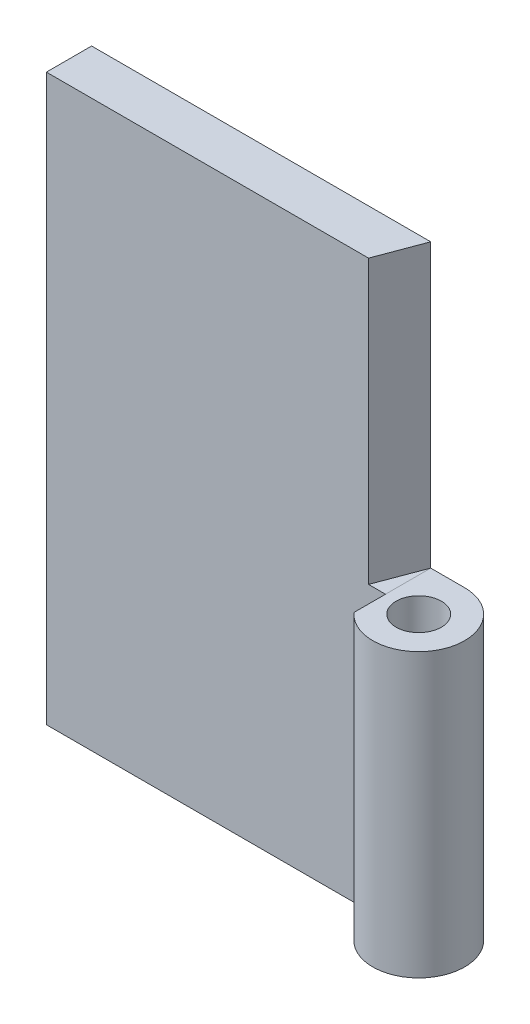
ISO-10303-21;
HEADER;
FILE_DESCRIPTION(('STEP AP214'),'2;1');
FILE_NAME('part.step','',(''),(''),'','','');
FILE_SCHEMA(('AUTOMOTIVE_DESIGN { 1 0 10303 214 1 1 1 1 }'));
ENDSEC;
DATA;
#1=APPLICATION_CONTEXT('core data for automotive mechanical design processes');
#2=APPLICATION_PROTOCOL_DEFINITION('international standard','automotive_design',2000,#1);
#3=PRODUCT_CONTEXT('',#1,'mechanical');
#4=PRODUCT('Part','Part','',(#3));
#5=PRODUCT_RELATED_PRODUCT_CATEGORY('part','',(#4));
#6=PRODUCT_DEFINITION_FORMATION('','',#4);
#7=PRODUCT_DEFINITION_CONTEXT('part definition',#1,'design');
#8=PRODUCT_DEFINITION('design','',#6,#7);
#9=PRODUCT_DEFINITION_SHAPE('','',#8);
#10=(LENGTH_UNIT() NAMED_UNIT(*) SI_UNIT(.MILLI.,.METRE.));
#11=(NAMED_UNIT(*) PLANE_ANGLE_UNIT() SI_UNIT($,.RADIAN.));
#12=(NAMED_UNIT(*) SI_UNIT($,.STERADIAN.) SOLID_ANGLE_UNIT());
#13=UNCERTAINTY_MEASURE_WITH_UNIT(LENGTH_MEASURE(1.E-05),#10,'distance_accuracy_value','');
#14=(GEOMETRIC_REPRESENTATION_CONTEXT(3) GLOBAL_UNCERTAINTY_ASSIGNED_CONTEXT((#13)) GLOBAL_UNIT_ASSIGNED_CONTEXT((#10,
#11,#12)) REPRESENTATION_CONTEXT('',''));
#15=CARTESIAN_POINT('',(0.,0.,0.));
#16=DIRECTION('',(0.,0.,1.));
#17=DIRECTION('',(1.,0.,0.));
#18=AXIS2_PLACEMENT_3D('',#15,#16,#17);
#19=CARTESIAN_POINT('',(15.,-12.5,3.4));
#20=DIRECTION('',(-1.,0.,0.));
#21=DIRECTION('',(0.,0.,1.));
#22=AXIS2_PLACEMENT_3D('',#19,#20,#21);
#23=PLANE('',#22);
#24=DIRECTION('',(0.,0.,-1.));
#25=VECTOR('',#24,1.);
#26=CARTESIAN_POINT('',(15.,-25.,3.4));
#27=LINE('',#26,#25);
#28=CARTESIAN_POINT('',(15.,-25.,3.4));
#29=VERTEX_POINT('',#28);
#30=CARTESIAN_POINT('',(15.,-25.,0.));
#31=VERTEX_POINT('',#30);
#32=EDGE_CURVE('E99',#29,#31,#27,.T.);
#33=ORIENTED_EDGE('',*,*,#32,.F.);
#34=DIRECTION('',(0.,-1.,0.));
#35=VECTOR('',#34,1.);
#36=CARTESIAN_POINT('',(15.,-12.5,3.4));
#37=LINE('',#36,#35);
#38=CARTESIAN_POINT('',(15.,-12.5,3.4));
#39=VERTEX_POINT('',#38);
#40=EDGE_CURVE('E12',#39,#29,#37,.T.);
#41=ORIENTED_EDGE('',*,*,#40,.F.);
#42=DIRECTION('',(0.,0.,-1.));
#43=VECTOR('',#42,1.);
#44=CARTESIAN_POINT('',(15.,-12.5,3.4));
#45=LINE('',#44,#43);
#46=CARTESIAN_POINT('',(15.,-12.5,0.));
#47=VERTEX_POINT('',#46);
#48=EDGE_CURVE('E88',#39,#47,#45,.T.);
#49=ORIENTED_EDGE('',*,*,#48,.T.);
#50=DIRECTION('',(0.,-1.,0.));
#51=VECTOR('',#50,1.);
#52=CARTESIAN_POINT('',(15.,-12.5,0.));
#53=LINE('',#52,#51);
#54=EDGE_CURVE('E47',#47,#31,#53,.T.);
#55=ORIENTED_EDGE('',*,*,#54,.T.);
#56=EDGE_LOOP('',(#33,#41,#49,#55));
#57=FACE_BOUND('',#56,.T.);
#58=ADVANCED_FACE('F44',(#57),#23,.T.);
#59=CARTESIAN_POINT('',(16.5,-12.5,2.03088235294118));
#60=DIRECTION('',(0.,-1.,0.));
#61=DIRECTION('',(0.,0.,-1.));
#62=AXIS2_PLACEMENT_3D('',#59,#60,#61);
#63=CYLINDRICAL_SURFACE('',#62,2.03088235294118);
#64=CARTESIAN_POINT('',(16.5,-25.,2.03088235294118));
#65=DIRECTION('',(0.,-1.,0.));
#66=DIRECTION('',(0.,0.,-1.));
#67=AXIS2_PLACEMENT_3D('',#64,#65,#66);
#68=CIRCLE('',#67,2.03088235294118);
#69=CARTESIAN_POINT('',(16.5,-25.,0.));
#70=VERTEX_POINT('',#69);
#71=EDGE_CURVE('E90',#70,#29,#68,.T.);
#72=ORIENTED_EDGE('',*,*,#71,.F.);
#73=DIRECTION('',(0.,-1.,0.));
#74=VECTOR('',#73,1.);
#75=CARTESIAN_POINT('',(16.5,-12.5,0.));
#76=LINE('',#75,#74);
#77=CARTESIAN_POINT('',(16.5,-12.5,0.));
#78=VERTEX_POINT('',#77);
#79=EDGE_CURVE('E53',#78,#70,#76,.T.);
#80=ORIENTED_EDGE('',*,*,#79,.F.);
#81=CARTESIAN_POINT('',(16.5,-12.5,2.03088235294118));
#82=DIRECTION('',(0.,-1.,0.));
#83=DIRECTION('',(0.,0.,-1.));
#84=AXIS2_PLACEMENT_3D('',#81,#82,#83);
#85=CIRCLE('',#84,2.03088235294118);
#86=EDGE_CURVE('E85',#78,#39,#85,.T.);
#87=ORIENTED_EDGE('',*,*,#86,.T.);
#88=ORIENTED_EDGE('',*,*,#40,.T.);
#89=EDGE_LOOP('',(#72,#80,#87,#88));
#90=FACE_BOUND('',#89,.T.);
#91=ADVANCED_FACE('F103',(#90),#63,.T.);
#92=CARTESIAN_POINT('',(15.,-12.5,0.));
#93=DIRECTION('',(0.,0.,-1.));
#94=DIRECTION('',(-1.,0.,0.));
#95=AXIS2_PLACEMENT_3D('',#92,#93,#94);
#96=PLANE('',#95);
#97=DIRECTION('',(1.,0.,0.));
#98=VECTOR('',#97,1.);
#99=CARTESIAN_POINT('',(15.,-25.,0.));
#100=LINE('',#99,#98);
#101=EDGE_CURVE('E83',#31,#70,#100,.T.);
#102=ORIENTED_EDGE('',*,*,#101,.F.);
#103=ORIENTED_EDGE('',*,*,#54,.F.);
#104=DIRECTION('',(1.,0.,0.));
#105=VECTOR('',#104,1.);
#106=CARTESIAN_POINT('',(15.,-12.5,0.));
#107=LINE('',#106,#105);
#108=EDGE_CURVE('E81',#47,#78,#107,.T.);
#109=ORIENTED_EDGE('',*,*,#108,.T.);
#110=ORIENTED_EDGE('',*,*,#79,.T.);
#111=EDGE_LOOP('',(#102,#103,#109,#110));
#112=FACE_BOUND('',#111,.T.);
#113=ADVANCED_FACE('F80',(#112),#96,.T.);
#114=CARTESIAN_POINT('',(16.5,-12.5,2.03088235294118));
#115=DIRECTION('',(0.,-1.,0.));
#116=DIRECTION('',(0.,0.,-1.));
#117=AXIS2_PLACEMENT_3D('',#114,#115,#116);
#118=PLANE('',#117);
#119=CARTESIAN_POINT('',(16.5,-12.5,2.03088235294118));
#120=DIRECTION('',(0.,-1.,0.));
#121=DIRECTION('',(0.,0.,-1.));
#122=AXIS2_PLACEMENT_3D('',#119,#120,#121);
#123=CIRCLE('',#122,1.);
#124=CARTESIAN_POINT('',(16.5,-12.5,1.03088235294118));
#125=VERTEX_POINT('',#124);
#126=EDGE_CURVE('E95',#125,#125,#123,.T.);
#127=ORIENTED_EDGE('',*,*,#126,.T.);
#128=EDGE_LOOP('',(#127));
#129=FACE_BOUND('',#128,.T.);
#130=ORIENTED_EDGE('',*,*,#48,.F.);
#131=ORIENTED_EDGE('',*,*,#86,.F.);
#132=ORIENTED_EDGE('',*,*,#108,.F.);
#133=EDGE_LOOP('',(#130,#131,#132));
#134=FACE_BOUND('',#133,.T.);
#135=ADVANCED_FACE('F87',(#129,#134),#118,.F.);
#136=CARTESIAN_POINT('',(16.5,-25.,2.03088235294118));
#137=DIRECTION('',(0.,-1.,0.));
#138=DIRECTION('',(0.,0.,-1.));
#139=AXIS2_PLACEMENT_3D('',#136,#137,#138);
#140=PLANE('',#139);
#141=CARTESIAN_POINT('',(16.5,-25.,2.03088235294118));
#142=DIRECTION('',(0.,-1.,0.));
#143=DIRECTION('',(0.,0.,-1.));
#144=AXIS2_PLACEMENT_3D('',#141,#142,#143);
#145=CIRCLE('',#144,1.);
#146=CARTESIAN_POINT('',(16.5,-25.,1.03088235294118));
#147=VERTEX_POINT('',#146);
#148=EDGE_CURVE('E125',#147,#147,#145,.T.);
#149=ORIENTED_EDGE('',*,*,#148,.F.);
#150=EDGE_LOOP('',(#149));
#151=FACE_BOUND('',#150,.T.);
#152=ORIENTED_EDGE('',*,*,#32,.T.);
#153=ORIENTED_EDGE('',*,*,#101,.T.);
#154=ORIENTED_EDGE('',*,*,#71,.T.);
#155=EDGE_LOOP('',(#152,#153,#154));
#156=FACE_BOUND('',#155,.T.);
#157=ADVANCED_FACE('F102',(#151,#156),#140,.T.);
#158=CARTESIAN_POINT('',(16.5,0.,2.03088235294118));
#159=DIRECTION('',(0.,-1.,0.));
#160=DIRECTION('',(0.,0.,-1.));
#161=AXIS2_PLACEMENT_3D('',#158,#159,#160);
#162=CYLINDRICAL_SURFACE('',#161,1.);
#163=ORIENTED_EDGE('',*,*,#148,.T.);
#164=EDGE_LOOP('',(#163));
#165=FACE_BOUND('',#164,.T.);
#166=ORIENTED_EDGE('',*,*,#126,.F.);
#167=EDGE_LOOP('',(#166));
#168=FACE_BOUND('',#167,.T.);
#169=ADVANCED_FACE('F113',(#165,#168),#162,.F.);
#170=CLOSED_SHELL('',(#58,#91,#113,#135,#157,#169));
#171=MANIFOLD_SOLID_BREP('B2',#170);
#172=CARTESIAN_POINT('',(0.,0.,2.));
#173=DIRECTION('',(1.,0.,0.));
#174=DIRECTION('',(0.,1.,0.));
#175=AXIS2_PLACEMENT_3D('',#172,#173,#174);
#176=PLANE('',#175);
#177=DIRECTION('',(0.,-1.,0.));
#178=VECTOR('',#177,1.);
#179=CARTESIAN_POINT('',(0.,0.,0.));
#180=LINE('',#179,#178);
#181=CARTESIAN_POINT('',(0.,0.,0.));
#182=VERTEX_POINT('',#181);
#183=CARTESIAN_POINT('',(0.,-25.,0.));
#184=VERTEX_POINT('',#183);
#185=EDGE_CURVE('E241',#182,#184,#180,.T.);
#186=ORIENTED_EDGE('',*,*,#185,.T.);
#187=DIRECTION('',(0.,0.,-1.));
#188=VECTOR('',#187,1.);
#189=CARTESIAN_POINT('',(0.,-25.,2.));
#190=LINE('',#189,#188);
#191=CARTESIAN_POINT('',(0.,-25.,2.));
#192=VERTEX_POINT('',#191);
#193=EDGE_CURVE('E42',#192,#184,#190,.T.);
#194=ORIENTED_EDGE('',*,*,#193,.F.);
#195=DIRECTION('',(0.,-1.,0.));
#196=VECTOR('',#195,1.);
#197=CARTESIAN_POINT('',(0.,0.,2.));
#198=LINE('',#197,#196);
#199=CARTESIAN_POINT('',(0.,0.,2.));
#200=VERTEX_POINT('',#199);
#201=EDGE_CURVE('E249',#200,#192,#198,.T.);
#202=ORIENTED_EDGE('',*,*,#201,.F.);
#203=DIRECTION('',(0.,0.,-1.));
#204=VECTOR('',#203,1.);
#205=CARTESIAN_POINT('',(0.,0.,2.));
#206=LINE('',#205,#204);
#207=EDGE_CURVE('E233',#200,#182,#206,.T.);
#208=ORIENTED_EDGE('',*,*,#207,.T.);
#209=EDGE_LOOP('',(#186,#194,#202,#208));
#210=FACE_BOUND('',#209,.T.);
#211=ADVANCED_FACE('F162',(#210),#176,.F.);
#212=CARTESIAN_POINT('',(0.,-25.,2.));
#213=DIRECTION('',(0.,1.,0.));
#214=DIRECTION('',(0.,0.,1.));
#215=AXIS2_PLACEMENT_3D('',#212,#213,#214);
#216=PLANE('',#215);
#217=DIRECTION('',(1.,0.,0.));
#218=VECTOR('',#217,1.);
#219=CARTESIAN_POINT('',(0.,-25.,0.));
#220=LINE('',#219,#218);
#221=CARTESIAN_POINT('',(15.,-25.,0.));
#222=VERTEX_POINT('',#221);
#223=EDGE_CURVE('E244',#184,#222,#220,.T.);
#224=ORIENTED_EDGE('',*,*,#223,.T.);
#225=DIRECTION('',(0.,0.,-1.));
#226=VECTOR('',#225,1.);
#227=CARTESIAN_POINT('',(15.,-25.,2.));
#228=LINE('',#227,#226);
#229=CARTESIAN_POINT('',(15.,-25.,2.));
#230=VERTEX_POINT('',#229);
#231=EDGE_CURVE('E169',#230,#222,#228,.T.);
#232=ORIENTED_EDGE('',*,*,#231,.F.);
#233=DIRECTION('',(1.,0.,0.));
#234=VECTOR('',#233,1.);
#235=CARTESIAN_POINT('',(0.,-25.,2.));
#236=LINE('',#235,#234);
#237=EDGE_CURVE('E208',#192,#230,#236,.T.);
#238=ORIENTED_EDGE('',*,*,#237,.F.);
#239=ORIENTED_EDGE('',*,*,#193,.T.);
#240=EDGE_LOOP('',(#224,#232,#238,#239));
#241=FACE_BOUND('',#240,.T.);
#242=ADVANCED_FACE('F264',(#241),#216,.F.);
#243=CARTESIAN_POINT('',(15.,0.,2.));
#244=DIRECTION('',(-1.,0.,0.));
#245=DIRECTION('',(0.,-1.,0.));
#246=AXIS2_PLACEMENT_3D('',#243,#244,#245);
#247=PLANE('',#246);
#248=DIRECTION('',(0.,1.,0.));
#249=VECTOR('',#248,1.);
#250=CARTESIAN_POINT('',(15.,0.,0.));
#251=LINE('',#250,#249);
#252=CARTESIAN_POINT('',(15.,-12.5,0.));
#253=VERTEX_POINT('',#252);
#254=EDGE_CURVE('E246',#222,#253,#251,.T.);
#255=ORIENTED_EDGE('',*,*,#254,.T.);
#256=DIRECTION('',(0.,0.,-1.));
#257=VECTOR('',#256,1.);
#258=CARTESIAN_POINT('',(15.,-12.5,2.));
#259=LINE('',#258,#257);
#260=CARTESIAN_POINT('',(15.,-12.5,2.));
#261=VERTEX_POINT('',#260);
#262=EDGE_CURVE('E176',#261,#253,#259,.T.);
#263=ORIENTED_EDGE('',*,*,#262,.F.);
#264=DIRECTION('',(0.,1.,0.));
#265=VECTOR('',#264,1.);
#266=CARTESIAN_POINT('',(15.,0.,2.));
#267=LINE('',#266,#265);
#268=EDGE_CURVE('E235',#230,#261,#267,.T.);
#269=ORIENTED_EDGE('',*,*,#268,.F.);
#270=ORIENTED_EDGE('',*,*,#231,.T.);
#271=EDGE_LOOP('',(#255,#263,#269,#270));
#272=FACE_BOUND('',#271,.T.);
#273=ADVANCED_FACE('F254',(#272),#247,.F.);
#274=CARTESIAN_POINT('',(0.,0.,2.));
#275=DIRECTION('',(0.,-1.,0.));
#276=DIRECTION('',(0.,0.,-1.));
#277=AXIS2_PLACEMENT_3D('',#274,#275,#276);
#278=PLANE('',#277);
#279=DIRECTION('',(-1.,0.,0.));
#280=VECTOR('',#279,1.);
#281=CARTESIAN_POINT('',(0.,0.,2.));
#282=LINE('',#281,#280);
#283=CARTESIAN_POINT('',(14.25,0.,2.));
#284=VERTEX_POINT('',#283);
#285=EDGE_CURVE('E185',#284,#200,#282,.T.);
#286=ORIENTED_EDGE('',*,*,#285,.F.);
#287=DIRECTION('',(-0.351123441588392,0.,0.936329177569045));
#288=VECTOR('',#287,1.);
#289=CARTESIAN_POINT('',(15.,0.,0.));
#290=LINE('',#289,#288);
#291=CARTESIAN_POINT('',(15.,0.,0.));
#292=VERTEX_POINT('',#291);
#293=EDGE_CURVE('E220',#292,#284,#290,.T.);
#294=ORIENTED_EDGE('',*,*,#293,.F.);
#295=DIRECTION('',(-1.,0.,0.));
#296=VECTOR('',#295,1.);
#297=CARTESIAN_POINT('',(0.,0.,0.));
#298=LINE('',#297,#296);
#299=EDGE_CURVE('E203',#292,#182,#298,.T.);
#300=ORIENTED_EDGE('',*,*,#299,.T.);
#301=ORIENTED_EDGE('',*,*,#207,.F.);
#302=EDGE_LOOP('',(#286,#294,#300,#301));
#303=FACE_BOUND('',#302,.T.);
#304=ADVANCED_FACE('F232',(#303),#278,.F.);
#305=CARTESIAN_POINT('',(0.,0.,2.));
#306=DIRECTION('',(0.,0.,1.));
#307=DIRECTION('',(1.,0.,0.));
#308=AXIS2_PLACEMENT_3D('',#305,#306,#307);
#309=PLANE('',#308);
#310=DIRECTION('',(1.,0.,0.));
#311=VECTOR('',#310,1.);
#312=CARTESIAN_POINT('',(14.25,-12.5,2.));
#313=LINE('',#312,#311);
#314=CARTESIAN_POINT('',(14.25,-12.5,2.));
#315=VERTEX_POINT('',#314);
#316=EDGE_CURVE('E229',#315,#261,#313,.T.);
#317=ORIENTED_EDGE('',*,*,#316,.F.);
#318=DIRECTION('',(0.,1.,0.));
#319=VECTOR('',#318,1.);
#320=CARTESIAN_POINT('',(14.25,-14.6360009363294,2.));
#321=LINE('',#320,#319);
#322=EDGE_CURVE('E222',#315,#284,#321,.T.);
#323=ORIENTED_EDGE('',*,*,#322,.T.);
#324=ORIENTED_EDGE('',*,*,#285,.T.);
#325=ORIENTED_EDGE('',*,*,#201,.T.);
#326=ORIENTED_EDGE('',*,*,#237,.T.);
#327=ORIENTED_EDGE('',*,*,#268,.T.);
#328=EDGE_LOOP('',(#317,#323,#324,#325,#326,#327));
#329=FACE_BOUND('',#328,.T.);
#330=ADVANCED_FACE('F227',(#329),#309,.T.);
#331=CARTESIAN_POINT('',(0.,0.,0.));
#332=DIRECTION('',(0.,0.,1.));
#333=DIRECTION('',(1.,0.,0.));
#334=AXIS2_PLACEMENT_3D('',#331,#332,#333);
#335=PLANE('',#334);
#336=ORIENTED_EDGE('',*,*,#185,.F.);
#337=ORIENTED_EDGE('',*,*,#299,.F.);
#338=DIRECTION('',(0.,1.,0.));
#339=VECTOR('',#338,1.);
#340=CARTESIAN_POINT('',(15.,-14.6360009363294,0.));
#341=LINE('',#340,#339);
#342=EDGE_CURVE('E224',#253,#292,#341,.T.);
#343=ORIENTED_EDGE('',*,*,#342,.F.);
#344=ORIENTED_EDGE('',*,*,#254,.F.);
#345=ORIENTED_EDGE('',*,*,#223,.F.);
#346=EDGE_LOOP('',(#336,#337,#343,#344,#345));
#347=FACE_BOUND('',#346,.T.);
#348=ADVANCED_FACE('F257',(#347),#335,.F.);
#349=CARTESIAN_POINT('',(16.5,-12.5,2.03088235294118));
#350=DIRECTION('',(0.,-1.,0.));
#351=DIRECTION('',(0.,0.,-1.));
#352=AXIS2_PLACEMENT_3D('',#349,#350,#351);
#353=PLANE('',#352);
#354=ORIENTED_EDGE('',*,*,#316,.T.);
#355=ORIENTED_EDGE('',*,*,#262,.T.);
#356=DIRECTION('',(-0.351123441588392,0.,0.936329177569045));
#357=VECTOR('',#356,1.);
#358=CARTESIAN_POINT('',(15.,-12.5,0.));
#359=LINE('',#358,#357);
#360=EDGE_CURVE('E230',#253,#315,#359,.T.);
#361=ORIENTED_EDGE('',*,*,#360,.T.);
#362=EDGE_LOOP('',(#354,#355,#361));
#363=FACE_BOUND('',#362,.T.);
#364=ADVANCED_FACE('F276',(#363),#353,.F.);
#365=CARTESIAN_POINT('',(15.,-14.6360009363294,0.));
#366=DIRECTION('',(-0.936329177569045,0.,-0.351123441588392));
#367=DIRECTION('',(-0.351123441588392,0.,0.936329177569045));
#368=AXIS2_PLACEMENT_3D('',#365,#366,#367);
#369=PLANE('',#368);
#370=ORIENTED_EDGE('',*,*,#342,.T.);
#371=ORIENTED_EDGE('',*,*,#293,.T.);
#372=ORIENTED_EDGE('',*,*,#322,.F.);
#373=ORIENTED_EDGE('',*,*,#360,.F.);
#374=EDGE_LOOP('',(#370,#371,#372,#373));
#375=FACE_BOUND('',#374,.T.);
#376=ADVANCED_FACE('F221',(#375),#369,.F.);
#377=CLOSED_SHELL('',(#211,#242,#273,#304,#330,#348,#364,#376));
#378=MANIFOLD_SOLID_BREP('B6',#377);
#379=ADVANCED_BREP_SHAPE_REPRESENTATION('',(#18,#171,#378),#14);
#380=SHAPE_DEFINITION_REPRESENTATION(#9,#379);
ENDSEC;
END-ISO-10303-21;
